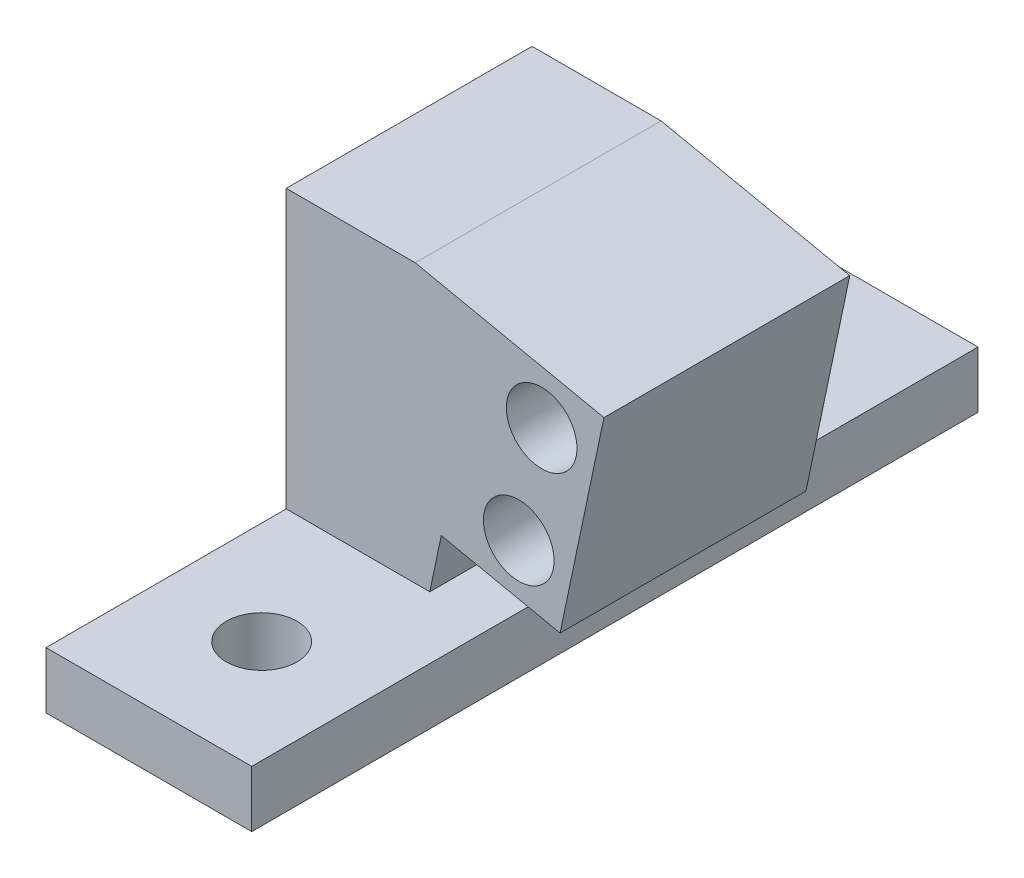
ISO-10303-21;
HEADER;
FILE_DESCRIPTION(('STEP AP214'),'2;1');
FILE_NAME('part.step','',(''),(''),'','','');
FILE_SCHEMA(('AUTOMOTIVE_DESIGN { 1 0 10303 214 1 1 1 1 }'));
ENDSEC;
DATA;
#1=APPLICATION_CONTEXT('core data for automotive mechanical design processes');
#2=APPLICATION_PROTOCOL_DEFINITION('international standard','automotive_design',2000,#1);
#3=PRODUCT_CONTEXT('',#1,'mechanical');
#4=PRODUCT('Part','Part','',(#3));
#5=PRODUCT_RELATED_PRODUCT_CATEGORY('part','',(#4));
#6=PRODUCT_DEFINITION_FORMATION('','',#4);
#7=PRODUCT_DEFINITION_CONTEXT('part definition',#1,'design');
#8=PRODUCT_DEFINITION('design','',#6,#7);
#9=PRODUCT_DEFINITION_SHAPE('','',#8);
#10=(LENGTH_UNIT() NAMED_UNIT(*) SI_UNIT(.MILLI.,.METRE.));
#11=(NAMED_UNIT(*) PLANE_ANGLE_UNIT() SI_UNIT($,.RADIAN.));
#12=(NAMED_UNIT(*) SI_UNIT($,.STERADIAN.) SOLID_ANGLE_UNIT());
#13=UNCERTAINTY_MEASURE_WITH_UNIT(LENGTH_MEASURE(1.E-05),#10,'distance_accuracy_value','');
#14=(GEOMETRIC_REPRESENTATION_CONTEXT(3) GLOBAL_UNCERTAINTY_ASSIGNED_CONTEXT((#13)) GLOBAL_UNIT_ASSIGNED_CONTEXT((#10,
#11,#12)) REPRESENTATION_CONTEXT('',''));
#15=CARTESIAN_POINT('',(0.,0.,0.));
#16=DIRECTION('',(0.,0.,1.));
#17=DIRECTION('',(1.,0.,0.));
#18=AXIS2_PLACEMENT_3D('',#15,#16,#17);
#19=CARTESIAN_POINT('',(-637.111164230449,215.21396012861,52.6678516261146));
#20=DIRECTION('',(0.,0.,-1.));
#21=DIRECTION('',(-1.,0.,0.));
#22=AXIS2_PLACEMENT_3D('',#19,#20,#21);
#23=CYLINDRICAL_SURFACE('',#22,3.17499999999993);
#24=CARTESIAN_POINT('',(-637.111164230449,215.21396012861,22.098));
#25=DIRECTION('',(0.,0.,-1.));
#26=DIRECTION('',(-1.,0.,0.));
#27=AXIS2_PLACEMENT_3D('',#24,#25,#26);
#28=CIRCLE('',#27,3.17499999999993);
#29=CARTESIAN_POINT('',(-640.286164230449,215.21396012861,22.098));
#30=VERTEX_POINT('',#29);
#31=EDGE_CURVE('E11',#30,#30,#28,.F.);
#32=ORIENTED_EDGE('',*,*,#31,.T.);
#33=EDGE_LOOP('',(#32));
#34=FACE_BOUND('',#33,.T.);
#35=CARTESIAN_POINT('',(-637.111164230449,215.21396012861,0.));
#36=DIRECTION('',(0.,0.,1.));
#37=DIRECTION('',(1.,0.,0.));
#38=AXIS2_PLACEMENT_3D('',#35,#36,#37);
#39=CIRCLE('',#38,3.17499999999993);
#40=CARTESIAN_POINT('',(-633.936164230449,215.21396012861,0.));
#41=VERTEX_POINT('',#40);
#42=EDGE_CURVE('E263',#41,#41,#39,.F.);
#43=ORIENTED_EDGE('',*,*,#42,.T.);
#44=EDGE_LOOP('',(#43));
#45=FACE_BOUND('',#44,.T.);
#46=ADVANCED_FACE('F47',(#34,#45),#23,.F.);
#47=CARTESIAN_POINT('',(-635.053635704384,224.999999999999,52.6678516261146));
#48=DIRECTION('',(0.,0.,-1.));
#49=DIRECTION('',(-1.,0.,0.));
#50=AXIS2_PLACEMENT_3D('',#47,#48,#49);
#51=CYLINDRICAL_SURFACE('',#50,3.17500000000015);
#52=CARTESIAN_POINT('',(-635.053635704384,224.999999999999,22.098));
#53=DIRECTION('',(0.,0.,-1.));
#54=DIRECTION('',(-1.,0.,0.));
#55=AXIS2_PLACEMENT_3D('',#52,#53,#54);
#56=CIRCLE('',#55,3.17500000000015);
#57=CARTESIAN_POINT('',(-638.228635704384,224.999999999999,22.098));
#58=VERTEX_POINT('',#57);
#59=EDGE_CURVE('E57',#58,#58,#56,.F.);
#60=ORIENTED_EDGE('',*,*,#59,.T.);
#61=EDGE_LOOP('',(#60));
#62=FACE_BOUND('',#61,.T.);
#63=CARTESIAN_POINT('',(-635.053635704384,224.999999999999,0.));
#64=DIRECTION('',(0.,0.,1.));
#65=DIRECTION('',(1.,0.,0.));
#66=AXIS2_PLACEMENT_3D('',#63,#64,#65);
#67=CIRCLE('',#66,3.17500000000015);
#68=CARTESIAN_POINT('',(-631.878635704384,224.999999999999,0.));
#69=VERTEX_POINT('',#68);
#70=EDGE_CURVE('E242',#69,#69,#67,.F.);
#71=ORIENTED_EDGE('',*,*,#70,.T.);
#72=EDGE_LOOP('',(#71));
#73=FACE_BOUND('',#72,.T.);
#74=ADVANCED_FACE('F49',(#62,#73),#51,.F.);
#75=CARTESIAN_POINT('',(0.,0.,0.));
#76=DIRECTION('',(0.,0.,1.));
#77=DIRECTION('',(1.,0.,0.));
#78=AXIS2_PLACEMENT_3D('',#75,#76,#77);
#79=PLANE('',#78);
#80=ORIENTED_EDGE('',*,*,#70,.F.);
#81=EDGE_LOOP('',(#80));
#82=FACE_BOUND('',#81,.T.);
#83=ORIENTED_EDGE('',*,*,#42,.F.);
#84=EDGE_LOOP('',(#83));
#85=FACE_BOUND('',#84,.T.);
#86=DIRECTION('',(0.205752852606502,0.978603987138969,0.));
#87=VECTOR('',#86,1.);
#88=CARTESIAN_POINT('',(-645.386600939676,205.898521661147,0.));
#89=LINE('',#88,#87);
#90=CARTESIAN_POINT('',(-645.10909165705,207.21841437226,0.));
#91=VERTEX_POINT('',#90);
#92=CARTESIAN_POINT('',(-644.080070325625,212.112656979479,0.));
#93=VERTEX_POINT('',#92);
#94=EDGE_CURVE('E72',#91,#93,#89,.T.);
#95=ORIENTED_EDGE('',*,*,#94,.F.);
#96=DIRECTION('',(-1.,0.,0.));
#97=VECTOR('',#96,1.);
#98=CARTESIAN_POINT('',(-3.11026475949186E-13,207.218414372261,0.));
#99=LINE('',#98,#97);
#100=CARTESIAN_POINT('',(-658.014289211447,207.21841437226,0.));
#101=VERTEX_POINT('',#100);
#102=EDGE_CURVE('E65',#91,#101,#99,.T.);
#103=ORIENTED_EDGE('',*,*,#102,.T.);
#104=DIRECTION('',(0.,-1.,0.));
#105=VECTOR('',#104,1.);
#106=CARTESIAN_POINT('',(-658.014289211447,207.21841437226,0.));
#107=LINE('',#106,#105);
#108=CARTESIAN_POINT('',(-658.014289211447,232.174381810683,0.));
#109=VERTEX_POINT('',#108);
#110=EDGE_CURVE('E149',#109,#101,#107,.T.);
#111=ORIENTED_EDGE('',*,*,#110,.F.);
#112=DIRECTION('',(-1.,0.,0.));
#113=VECTOR('',#112,1.);
#114=CARTESIAN_POINT('',(-615.342881724649,232.174381810683,0.));
#115=LINE('',#114,#113);
#116=CARTESIAN_POINT('',(-646.417262265417,232.174381810683,0.));
#117=VERTEX_POINT('',#116);
#118=EDGE_CURVE('E136',#117,#109,#115,.T.);
#119=ORIENTED_EDGE('',*,*,#118,.F.);
#120=DIRECTION('',(-0.978603987138969,0.205752852606502,0.));
#121=VECTOR('',#120,1.);
#122=CARTESIAN_POINT('',(19.3828610772317,92.1889776595995,0.));
#123=LINE('',#122,#121);
#124=CARTESIAN_POINT('',(-629.45625037284,228.608305414251,0.));
#125=VERTEX_POINT('',#124);
#126=EDGE_CURVE('E274',#125,#117,#123,.T.);
#127=ORIENTED_EDGE('',*,*,#126,.F.);
#128=DIRECTION('',(0.205752852606502,0.978603987138969,0.));
#129=VECTOR('',#128,1.);
#130=CARTESIAN_POINT('',(-648.839111450072,136.419327754652,0.));
#131=LINE('',#130,#129);
#132=CARTESIAN_POINT('',(-633.396746704819,209.866473294161,0.));
#133=VERTEX_POINT('',#132);
#134=EDGE_CURVE('E270',#133,#125,#131,.T.);
#135=ORIENTED_EDGE('',*,*,#134,.F.);
#136=DIRECTION('',(0.978603987138969,-0.205752852606502,0.));
#137=VECTOR('',#136,1.);
#138=CARTESIAN_POINT('',(15.442364745253,73.4471455395088,0.));
#139=LINE('',#138,#137);
#140=EDGE_CURVE('E267',#93,#133,#139,.T.);
#141=ORIENTED_EDGE('',*,*,#140,.F.);
#142=EDGE_LOOP('',(#95,#103,#111,#119,#127,#135,#141));
#143=FACE_BOUND('',#142,.T.);
#144=ADVANCED_FACE('F150',(#82,#85,#143),#79,.F.);
#145=CARTESIAN_POINT('',(19.3828610772317,92.1889776595995,52.6678516261146));
#146=DIRECTION('',(-0.205752852606502,-0.978603987138969,0.));
#147=DIRECTION('',(0.978603987138969,-0.205752852606502,0.));
#148=AXIS2_PLACEMENT_3D('',#145,#146,#147);
#149=PLANE('',#148);
#150=DIRECTION('',(0.,0.,-1.));
#151=VECTOR('',#150,1.);
#152=CARTESIAN_POINT('',(-646.417262265417,232.174381810683,52.6678516261146));
#153=LINE('',#152,#151);
#154=CARTESIAN_POINT('',(-646.417262265417,232.174381810683,22.098));
#155=VERTEX_POINT('',#154);
#156=EDGE_CURVE('E142',#155,#117,#153,.T.);
#157=ORIENTED_EDGE('',*,*,#156,.F.);
#158=DIRECTION('',(0.978603987138969,-0.205752852606502,0.));
#159=VECTOR('',#158,1.);
#160=CARTESIAN_POINT('',(19.3828610772317,92.1889776595995,22.0979999999999));
#161=LINE('',#160,#159);
#162=CARTESIAN_POINT('',(-629.45625037284,228.608305414251,22.098));
#163=VERTEX_POINT('',#162);
#164=EDGE_CURVE('E245',#155,#163,#161,.T.);
#165=ORIENTED_EDGE('',*,*,#164,.T.);
#166=DIRECTION('',(0.,0.,-1.));
#167=VECTOR('',#166,1.);
#168=CARTESIAN_POINT('',(-629.45625037284,228.608305414251,52.6678516261146));
#169=LINE('',#168,#167);
#170=EDGE_CURVE('E278',#163,#125,#169,.T.);
#171=ORIENTED_EDGE('',*,*,#170,.T.);
#172=ORIENTED_EDGE('',*,*,#126,.T.);
#173=EDGE_LOOP('',(#157,#165,#171,#172));
#174=FACE_BOUND('',#173,.T.);
#175=ADVANCED_FACE('F290',(#174),#149,.F.);
#176=CARTESIAN_POINT('',(-648.839111450072,136.419327754652,52.6678516261146));
#177=DIRECTION('',(-0.978603987138969,0.205752852606502,0.));
#178=DIRECTION('',(-0.205752852606502,-0.978603987138969,0.));
#179=AXIS2_PLACEMENT_3D('',#176,#177,#178);
#180=PLANE('',#179);
#181=ORIENTED_EDGE('',*,*,#170,.F.);
#182=DIRECTION('',(-0.205752852606502,-0.978603987138969,0.));
#183=VECTOR('',#182,1.);
#184=CARTESIAN_POINT('',(-648.839111450072,136.419327754652,22.098));
#185=LINE('',#184,#183);
#186=CARTESIAN_POINT('',(-633.396746704819,209.866473294161,22.098));
#187=VERTEX_POINT('',#186);
#188=EDGE_CURVE('E249',#163,#187,#185,.T.);
#189=ORIENTED_EDGE('',*,*,#188,.T.);
#190=DIRECTION('',(0.,0.,-1.));
#191=VECTOR('',#190,1.);
#192=CARTESIAN_POINT('',(-633.396746704819,209.866473294161,52.6678516261146));
#193=LINE('',#192,#191);
#194=EDGE_CURVE('E51',#187,#133,#193,.T.);
#195=ORIENTED_EDGE('',*,*,#194,.T.);
#196=ORIENTED_EDGE('',*,*,#134,.T.);
#197=EDGE_LOOP('',(#181,#189,#195,#196));
#198=FACE_BOUND('',#197,.T.);
#199=ADVANCED_FACE('F287',(#198),#180,.F.);
#200=CARTESIAN_POINT('',(15.442364745253,73.4471455395088,52.6678516261146));
#201=DIRECTION('',(0.205752852606502,0.978603987138969,0.));
#202=DIRECTION('',(-0.978603987138969,0.205752852606502,0.));
#203=AXIS2_PLACEMENT_3D('',#200,#201,#202);
#204=PLANE('',#203);
#205=DIRECTION('',(-0.978603987138969,0.205752852606502,0.));
#206=VECTOR('',#205,1.);
#207=CARTESIAN_POINT('',(15.442364745253,73.4471455395088,22.0979999999999));
#208=LINE('',#207,#206);
#209=CARTESIAN_POINT('',(-644.080070325625,212.112656979479,22.098));
#210=VERTEX_POINT('',#209);
#211=EDGE_CURVE('E253',#187,#210,#208,.T.);
#212=ORIENTED_EDGE('',*,*,#211,.T.);
#213=DIRECTION('',(0.,0.,-1.));
#214=VECTOR('',#213,1.);
#215=CARTESIAN_POINT('',(-644.080070325625,212.112656979479,22.098));
#216=LINE('',#215,#214);
#217=EDGE_CURVE('E236',#210,#93,#216,.T.);
#218=ORIENTED_EDGE('',*,*,#217,.T.);
#219=ORIENTED_EDGE('',*,*,#140,.T.);
#220=ORIENTED_EDGE('',*,*,#194,.F.);
#221=EDGE_LOOP('',(#212,#218,#219,#220));
#222=FACE_BOUND('',#221,.T.);
#223=ADVANCED_FACE('F295',(#222),#204,.F.);
#224=CARTESIAN_POINT('',(-605.953207278711,204.096430869698,22.098));
#225=DIRECTION('',(0.,0.,-1.));
#226=DIRECTION('',(1.,0.,0.));
#227=AXIS2_PLACEMENT_3D('',#224,#225,#226);
#228=PLANE('',#227);
#229=ORIENTED_EDGE('',*,*,#59,.F.);
#230=EDGE_LOOP('',(#229));
#231=FACE_BOUND('',#230,.T.);
#232=ORIENTED_EDGE('',*,*,#164,.F.);
#233=DIRECTION('',(-1.,0.,0.));
#234=VECTOR('',#233,1.);
#235=CARTESIAN_POINT('',(-615.342881724649,232.174381810683,22.098));
#236=LINE('',#235,#234);
#237=CARTESIAN_POINT('',(-658.014289211447,232.174381810683,22.098));
#238=VERTEX_POINT('',#237);
#239=EDGE_CURVE('E146',#155,#238,#236,.T.);
#240=ORIENTED_EDGE('',*,*,#239,.T.);
#241=DIRECTION('',(0.,1.,0.));
#242=VECTOR('',#241,1.);
#243=CARTESIAN_POINT('',(-658.014289211447,207.21841437226,22.098));
#244=LINE('',#243,#242);
#245=CARTESIAN_POINT('',(-658.014289211447,207.21841437226,22.098));
#246=VERTEX_POINT('',#245);
#247=EDGE_CURVE('E154',#246,#238,#244,.T.);
#248=ORIENTED_EDGE('',*,*,#247,.F.);
#249=DIRECTION('',(1.,0.,0.));
#250=VECTOR('',#249,1.);
#251=CARTESIAN_POINT('',(-605.953207278711,207.21841437226,22.098));
#252=LINE('',#251,#250);
#253=CARTESIAN_POINT('',(-645.10909165705,207.21841437226,22.098));
#254=VERTEX_POINT('',#253);
#255=EDGE_CURVE('E218',#246,#254,#252,.T.);
#256=ORIENTED_EDGE('',*,*,#255,.T.);
#257=DIRECTION('',(0.205752852606502,0.978603987138969,0.));
#258=VECTOR('',#257,1.);
#259=CARTESIAN_POINT('',(-645.386600939676,205.898521661147,22.098));
#260=LINE('',#259,#258);
#261=EDGE_CURVE('E239',#254,#210,#260,.T.);
#262=ORIENTED_EDGE('',*,*,#261,.T.);
#263=ORIENTED_EDGE('',*,*,#211,.F.);
#264=ORIENTED_EDGE('',*,*,#188,.F.);
#265=EDGE_LOOP('',(#232,#240,#248,#256,#262,#263,#264));
#266=FACE_BOUND('',#265,.T.);
#267=ORIENTED_EDGE('',*,*,#31,.F.);
#268=EDGE_LOOP('',(#267));
#269=FACE_BOUND('',#268,.T.);
#270=ADVANCED_FACE('F292',(#231,#266,#269),#228,.F.);
#271=CARTESIAN_POINT('',(-645.386600939676,205.898521661147,22.098));
#272=DIRECTION('',(0.978603987138969,-0.205752852606502,0.));
#273=DIRECTION('',(0.205752852606502,0.978603987138969,0.));
#274=AXIS2_PLACEMENT_3D('',#271,#272,#273);
#275=PLANE('',#274);
#276=DIRECTION('',(0.,0.,1.));
#277=VECTOR('',#276,1.);
#278=CARTESIAN_POINT('',(-645.10909165705,207.21841437226,22.098));
#279=LINE('',#278,#277);
#280=EDGE_CURVE('E231',#91,#254,#279,.T.);
#281=ORIENTED_EDGE('',*,*,#280,.F.);
#282=ORIENTED_EDGE('',*,*,#94,.T.);
#283=ORIENTED_EDGE('',*,*,#217,.F.);
#284=ORIENTED_EDGE('',*,*,#261,.F.);
#285=EDGE_LOOP('',(#281,#282,#283,#284));
#286=FACE_BOUND('',#285,.T.);
#287=ADVANCED_FACE('F296',(#286),#275,.T.);
#288=CARTESIAN_POINT('',(-3.11026475949186E-13,207.218414372261,-2.64321809908086E-13));
#289=DIRECTION('',(0.,1.,0.));
#290=DIRECTION('',(-1.,0.,0.));
#291=AXIS2_PLACEMENT_3D('',#288,#289,#290);
#292=PLANE('',#291);
#293=ORIENTED_EDGE('',*,*,#255,.F.);
#294=DIRECTION('',(0.,0.,1.));
#295=VECTOR('',#294,1.);
#296=CARTESIAN_POINT('',(-658.014289211447,207.21841437226,-21.59));
#297=LINE('',#296,#295);
#298=CARTESIAN_POINT('',(-658.014289211447,207.21841437226,43.688));
#299=VERTEX_POINT('',#298);
#300=EDGE_CURVE('E179',#246,#299,#297,.T.);
#301=ORIENTED_EDGE('',*,*,#300,.T.);
#302=DIRECTION('',(1.,0.,0.));
#303=VECTOR('',#302,1.);
#304=CARTESIAN_POINT('',(-658.014289211447,207.21841437226,43.688));
#305=LINE('',#304,#303);
#306=CARTESIAN_POINT('',(-639.522402462874,207.21841437226,43.688));
#307=VERTEX_POINT('',#306);
#308=EDGE_CURVE('E204',#299,#307,#305,.T.);
#309=ORIENTED_EDGE('',*,*,#308,.T.);
#310=DIRECTION('',(0.,0.,-1.));
#311=VECTOR('',#310,1.);
#312=CARTESIAN_POINT('',(-639.522402462874,207.21841437226,-21.59));
#313=LINE('',#312,#311);
#314=CARTESIAN_POINT('',(-639.522402462874,207.21841437226,-21.59));
#315=VERTEX_POINT('',#314);
#316=EDGE_CURVE('E208',#307,#315,#313,.T.);
#317=ORIENTED_EDGE('',*,*,#316,.T.);
#318=DIRECTION('',(-1.,0.,0.));
#319=VECTOR('',#318,1.);
#320=CARTESIAN_POINT('',(-658.014289211447,207.21841437226,-21.59));
#321=LINE('',#320,#319);
#322=CARTESIAN_POINT('',(-658.014289211447,207.21841437226,-21.59));
#323=VERTEX_POINT('',#322);
#324=EDGE_CURVE('E188',#315,#323,#321,.T.);
#325=ORIENTED_EDGE('',*,*,#324,.T.);
#326=EDGE_CURVE('E201',#323,#101,#297,.T.);
#327=ORIENTED_EDGE('',*,*,#326,.T.);
#328=ORIENTED_EDGE('',*,*,#102,.F.);
#329=ORIENTED_EDGE('',*,*,#280,.T.);
#330=EDGE_LOOP('',(#293,#301,#309,#317,#325,#327,#328,#329));
#331=FACE_BOUND('',#330,.T.);
#332=CARTESIAN_POINT('',(-648.793402462874,207.21841437226,33.528));
#333=DIRECTION('',(0.,1.,0.));
#334=DIRECTION('',(0.,0.,1.));
#335=AXIS2_PLACEMENT_3D('',#332,#333,#334);
#336=CIRCLE('',#335,3.17500000000008);
#337=CARTESIAN_POINT('',(-648.793402462874,207.21841437226,36.7030000000001));
#338=VERTEX_POINT('',#337);
#339=EDGE_CURVE('E171',#338,#338,#336,.T.);
#340=ORIENTED_EDGE('',*,*,#339,.F.);
#341=EDGE_LOOP('',(#340));
#342=FACE_BOUND('',#341,.T.);
#343=CARTESIAN_POINT('',(-648.793402462874,207.21841437226,-11.43));
#344=DIRECTION('',(0.,1.,0.));
#345=DIRECTION('',(0.,0.,1.));
#346=AXIS2_PLACEMENT_3D('',#343,#344,#345);
#347=CIRCLE('',#346,3.17500000000008);
#348=CARTESIAN_POINT('',(-648.793402462874,207.21841437226,-8.25499999999992));
#349=VERTEX_POINT('',#348);
#350=EDGE_CURVE('E145',#349,#349,#347,.T.);
#351=ORIENTED_EDGE('',*,*,#350,.F.);
#352=EDGE_LOOP('',(#351));
#353=FACE_BOUND('',#352,.T.);
#354=ADVANCED_FACE('F298',(#331,#342,#353),#292,.T.);
#355=CARTESIAN_POINT('',(-658.014289211447,202.13841437226,-21.59));
#356=DIRECTION('',(-1.,0.,0.));
#357=DIRECTION('',(0.,-1.,0.));
#358=AXIS2_PLACEMENT_3D('',#355,#356,#357);
#359=PLANE('',#358);
#360=ORIENTED_EDGE('',*,*,#326,.F.);
#361=DIRECTION('',(0.,1.,0.));
#362=VECTOR('',#361,1.);
#363=CARTESIAN_POINT('',(-658.014289211447,202.13841437226,-21.59));
#364=LINE('',#363,#362);
#365=CARTESIAN_POINT('',(-658.014289211447,202.13841437226,-21.59));
#366=VERTEX_POINT('',#365);
#367=EDGE_CURVE('E215',#366,#323,#364,.T.);
#368=ORIENTED_EDGE('',*,*,#367,.F.);
#369=DIRECTION('',(0.,0.,1.));
#370=VECTOR('',#369,1.);
#371=CARTESIAN_POINT('',(-658.014289211447,202.13841437226,-21.59));
#372=LINE('',#371,#370);
#373=CARTESIAN_POINT('',(-658.014289211447,202.13841437226,43.688));
#374=VERTEX_POINT('',#373);
#375=EDGE_CURVE('E183',#366,#374,#372,.T.);
#376=ORIENTED_EDGE('',*,*,#375,.T.);
#377=DIRECTION('',(0.,1.,0.));
#378=VECTOR('',#377,1.);
#379=CARTESIAN_POINT('',(-658.014289211447,202.13841437226,43.688));
#380=LINE('',#379,#378);
#381=EDGE_CURVE('E200',#374,#299,#380,.T.);
#382=ORIENTED_EDGE('',*,*,#381,.T.);
#383=ORIENTED_EDGE('',*,*,#300,.F.);
#384=ORIENTED_EDGE('',*,*,#247,.T.);
#385=DIRECTION('',(0.,0.,-1.));
#386=VECTOR('',#385,1.);
#387=CARTESIAN_POINT('',(-658.014289211447,232.174381810683,0.));
#388=LINE('',#387,#386);
#389=EDGE_CURVE('E140',#238,#109,#388,.T.);
#390=ORIENTED_EDGE('',*,*,#389,.T.);
#391=ORIENTED_EDGE('',*,*,#110,.T.);
#392=EDGE_LOOP('',(#360,#368,#376,#382,#383,#384,#390,#391));
#393=FACE_BOUND('',#392,.T.);
#394=ADVANCED_FACE('F157',(#393),#359,.T.);
#395=CARTESIAN_POINT('',(-658.014289211447,202.13841437226,-21.59));
#396=DIRECTION('',(0.,0.,-1.));
#397=DIRECTION('',(0.,1.,0.));
#398=AXIS2_PLACEMENT_3D('',#395,#396,#397);
#399=PLANE('',#398);
#400=ORIENTED_EDGE('',*,*,#324,.F.);
#401=DIRECTION('',(0.,1.,0.));
#402=VECTOR('',#401,1.);
#403=CARTESIAN_POINT('',(-639.522402462874,202.13841437226,-21.59));
#404=LINE('',#403,#402);
#405=CARTESIAN_POINT('',(-639.522402462874,202.13841437226,-21.59));
#406=VERTEX_POINT('',#405);
#407=EDGE_CURVE('E219',#406,#315,#404,.T.);
#408=ORIENTED_EDGE('',*,*,#407,.F.);
#409=DIRECTION('',(-1.,0.,0.));
#410=VECTOR('',#409,1.);
#411=CARTESIAN_POINT('',(-658.014289211447,202.13841437226,-21.59));
#412=LINE('',#411,#410);
#413=EDGE_CURVE('E196',#406,#366,#412,.T.);
#414=ORIENTED_EDGE('',*,*,#413,.T.);
#415=ORIENTED_EDGE('',*,*,#367,.T.);
#416=EDGE_LOOP('',(#400,#408,#414,#415));
#417=FACE_BOUND('',#416,.T.);
#418=ADVANCED_FACE('F308',(#417),#399,.T.);
#419=CARTESIAN_POINT('',(-639.522402462874,202.13841437226,-21.59));
#420=DIRECTION('',(1.,0.,0.));
#421=DIRECTION('',(0.,1.,0.));
#422=AXIS2_PLACEMENT_3D('',#419,#420,#421);
#423=PLANE('',#422);
#424=ORIENTED_EDGE('',*,*,#316,.F.);
#425=DIRECTION('',(0.,1.,0.));
#426=VECTOR('',#425,1.);
#427=CARTESIAN_POINT('',(-639.522402462874,202.13841437226,43.688));
#428=LINE('',#427,#426);
#429=CARTESIAN_POINT('',(-639.522402462874,202.13841437226,43.688));
#430=VERTEX_POINT('',#429);
#431=EDGE_CURVE('E222',#430,#307,#428,.T.);
#432=ORIENTED_EDGE('',*,*,#431,.F.);
#433=DIRECTION('',(0.,0.,-1.));
#434=VECTOR('',#433,1.);
#435=CARTESIAN_POINT('',(-639.522402462874,202.13841437226,-21.59));
#436=LINE('',#435,#434);
#437=EDGE_CURVE('E192',#430,#406,#436,.T.);
#438=ORIENTED_EDGE('',*,*,#437,.T.);
#439=ORIENTED_EDGE('',*,*,#407,.T.);
#440=EDGE_LOOP('',(#424,#432,#438,#439));
#441=FACE_BOUND('',#440,.T.);
#442=ADVANCED_FACE('F311',(#441),#423,.T.);
#443=CARTESIAN_POINT('',(-658.014289211447,202.13841437226,43.688));
#444=DIRECTION('',(0.,0.,1.));
#445=DIRECTION('',(0.,-1.,0.));
#446=AXIS2_PLACEMENT_3D('',#443,#444,#445);
#447=PLANE('',#446);
#448=ORIENTED_EDGE('',*,*,#308,.F.);
#449=ORIENTED_EDGE('',*,*,#381,.F.);
#450=DIRECTION('',(1.,0.,0.));
#451=VECTOR('',#450,1.);
#452=CARTESIAN_POINT('',(-658.014289211447,202.13841437226,43.688));
#453=LINE('',#452,#451);
#454=EDGE_CURVE('E187',#374,#430,#453,.T.);
#455=ORIENTED_EDGE('',*,*,#454,.T.);
#456=ORIENTED_EDGE('',*,*,#431,.T.);
#457=EDGE_LOOP('',(#448,#449,#455,#456));
#458=FACE_BOUND('',#457,.T.);
#459=ADVANCED_FACE('F314',(#458),#447,.T.);
#460=CARTESIAN_POINT('',(-3.0390783204988E-13,202.138414372261,-2.56034120824944E-13));
#461=DIRECTION('',(0.,1.,0.));
#462=DIRECTION('',(-1.,0.,0.));
#463=AXIS2_PLACEMENT_3D('',#460,#461,#462);
#464=PLANE('',#463);
#465=CARTESIAN_POINT('',(-648.793402462874,202.13841437226,-11.43));
#466=DIRECTION('',(0.,1.,0.));
#467=DIRECTION('',(0.,0.,1.));
#468=AXIS2_PLACEMENT_3D('',#465,#466,#467);
#469=CIRCLE('',#468,3.17500000000008);
#470=CARTESIAN_POINT('',(-648.793402462874,202.13841437226,-8.25499999999991));
#471=VERTEX_POINT('',#470);
#472=EDGE_CURVE('E167',#471,#471,#469,.T.);
#473=ORIENTED_EDGE('',*,*,#472,.T.);
#474=EDGE_LOOP('',(#473));
#475=FACE_BOUND('',#474,.T.);
#476=CARTESIAN_POINT('',(-648.793402462874,202.13841437226,33.528));
#477=DIRECTION('',(0.,1.,0.));
#478=DIRECTION('',(0.,0.,1.));
#479=AXIS2_PLACEMENT_3D('',#476,#477,#478);
#480=CIRCLE('',#479,3.17500000000008);
#481=CARTESIAN_POINT('',(-648.793402462874,202.13841437226,36.7030000000001));
#482=VERTEX_POINT('',#481);
#483=EDGE_CURVE('E175',#482,#482,#480,.T.);
#484=ORIENTED_EDGE('',*,*,#483,.T.);
#485=EDGE_LOOP('',(#484));
#486=FACE_BOUND('',#485,.T.);
#487=ORIENTED_EDGE('',*,*,#375,.F.);
#488=ORIENTED_EDGE('',*,*,#413,.F.);
#489=ORIENTED_EDGE('',*,*,#437,.F.);
#490=ORIENTED_EDGE('',*,*,#454,.F.);
#491=EDGE_LOOP('',(#487,#488,#489,#490));
#492=FACE_BOUND('',#491,.T.);
#493=ADVANCED_FACE('F306',(#475,#486,#492),#464,.F.);
#494=CARTESIAN_POINT('',(-648.793402462874,202.13841437226,33.528));
#495=DIRECTION('',(0.,1.,0.));
#496=DIRECTION('',(0.,0.,1.));
#497=AXIS2_PLACEMENT_3D('',#494,#495,#496);
#498=CYLINDRICAL_SURFACE('',#497,3.17500000000008);
#499=ORIENTED_EDGE('',*,*,#483,.F.);
#500=EDGE_LOOP('',(#499));
#501=FACE_BOUND('',#500,.T.);
#502=ORIENTED_EDGE('',*,*,#339,.T.);
#503=EDGE_LOOP('',(#502));
#504=FACE_BOUND('',#503,.T.);
#505=ADVANCED_FACE('F322',(#501,#504),#498,.F.);
#506=CARTESIAN_POINT('',(-648.793402462874,202.13841437226,-11.43));
#507=DIRECTION('',(0.,1.,0.));
#508=DIRECTION('',(0.,0.,1.));
#509=AXIS2_PLACEMENT_3D('',#506,#507,#508);
#510=CYLINDRICAL_SURFACE('',#509,3.17500000000008);
#511=ORIENTED_EDGE('',*,*,#472,.F.);
#512=EDGE_LOOP('',(#511));
#513=FACE_BOUND('',#512,.T.);
#514=ORIENTED_EDGE('',*,*,#350,.T.);
#515=EDGE_LOOP('',(#514));
#516=FACE_BOUND('',#515,.T.);
#517=ADVANCED_FACE('F361',(#513,#516),#510,.F.);
#518=CARTESIAN_POINT('',(-615.342881724649,232.174381810683,0.));
#519=DIRECTION('',(0.,1.,0.));
#520=DIRECTION('',(-1.,0.,0.));
#521=AXIS2_PLACEMENT_3D('',#518,#519,#520);
#522=PLANE('',#521);
#523=ORIENTED_EDGE('',*,*,#239,.F.);
#524=ORIENTED_EDGE('',*,*,#156,.T.);
#525=ORIENTED_EDGE('',*,*,#118,.T.);
#526=ORIENTED_EDGE('',*,*,#389,.F.);
#527=EDGE_LOOP('',(#523,#524,#525,#526));
#528=FACE_BOUND('',#527,.T.);
#529=ADVANCED_FACE('F138',(#528),#522,.T.);
#530=CLOSED_SHELL('',(#46,#74,#144,#175,#199,#223,#270,#287,#354,#394,#418,#442,#459,#493,#505,
#517,#529));
#531=MANIFOLD_SOLID_BREP('B2',#530);
#532=ADVANCED_BREP_SHAPE_REPRESENTATION('',(#18,#531),#14);
#533=SHAPE_DEFINITION_REPRESENTATION(#9,#532);
ENDSEC;
END-ISO-10303-21;
